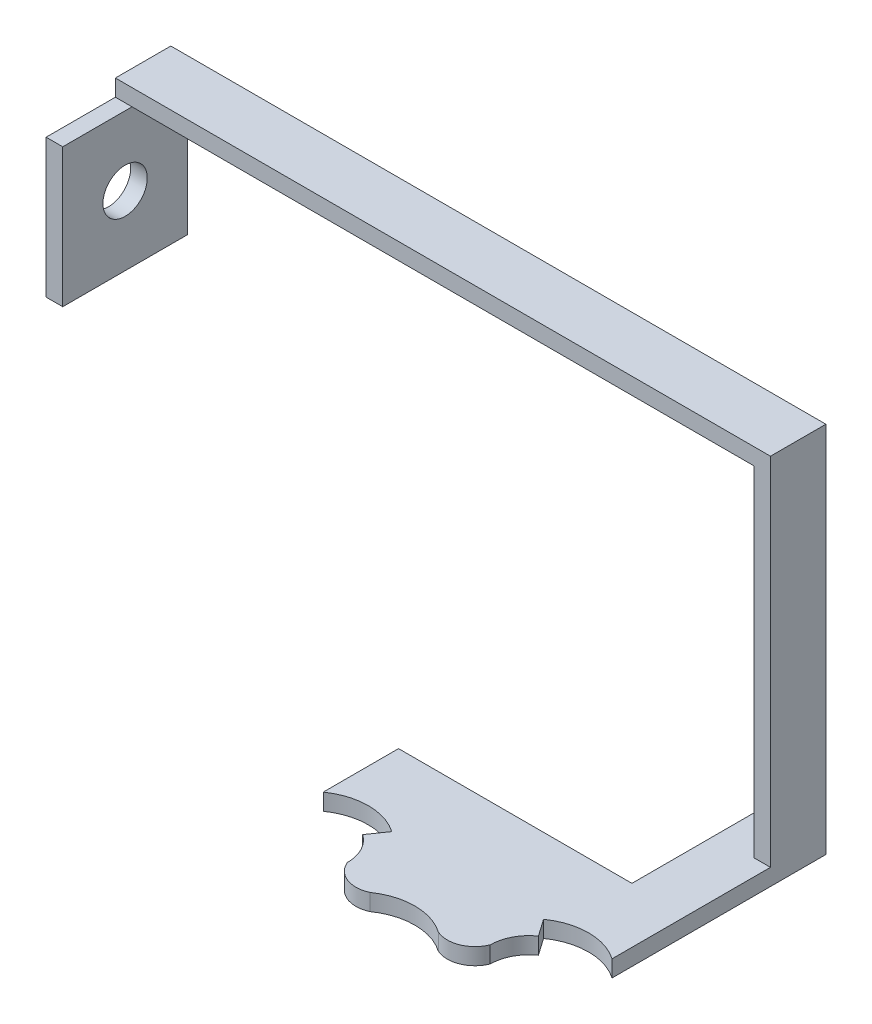
ISO-10303-21;
HEADER;
FILE_DESCRIPTION(('STEP AP214'),'2;1');
FILE_NAME('part.step','',(''),(''),'','','');
FILE_SCHEMA(('AUTOMOTIVE_DESIGN { 1 0 10303 214 1 1 1 1 }'));
ENDSEC;
DATA;
#1=APPLICATION_CONTEXT('core data for automotive mechanical design processes');
#2=APPLICATION_PROTOCOL_DEFINITION('international standard','automotive_design',2000,#1);
#3=PRODUCT_CONTEXT('',#1,'mechanical');
#4=PRODUCT('Part','Part','',(#3));
#5=PRODUCT_RELATED_PRODUCT_CATEGORY('part','',(#4));
#6=PRODUCT_DEFINITION_FORMATION('','',#4);
#7=PRODUCT_DEFINITION_CONTEXT('part definition',#1,'design');
#8=PRODUCT_DEFINITION('design','',#6,#7);
#9=PRODUCT_DEFINITION_SHAPE('','',#8);
#10=(LENGTH_UNIT() NAMED_UNIT(*) SI_UNIT(.MILLI.,.METRE.));
#11=(NAMED_UNIT(*) PLANE_ANGLE_UNIT() SI_UNIT($,.RADIAN.));
#12=(NAMED_UNIT(*) SI_UNIT($,.STERADIAN.) SOLID_ANGLE_UNIT());
#13=UNCERTAINTY_MEASURE_WITH_UNIT(LENGTH_MEASURE(1.E-05),#10,'distance_accuracy_value','');
#14=(GEOMETRIC_REPRESENTATION_CONTEXT(3) GLOBAL_UNCERTAINTY_ASSIGNED_CONTEXT((#13)) GLOBAL_UNIT_ASSIGNED_CONTEXT((#10,
#11,#12)) REPRESENTATION_CONTEXT('',''));
#15=CARTESIAN_POINT('',(0.,0.,0.));
#16=DIRECTION('',(0.,0.,1.));
#17=DIRECTION('',(1.,0.,0.));
#18=AXIS2_PLACEMENT_3D('',#15,#16,#17);
#19=CARTESIAN_POINT('',(-92.1544308814646,64.25,-58.8892135655432));
#20=DIRECTION('',(0.,1.,0.));
#21=DIRECTION('',(0.,0.,1.));
#22=AXIS2_PLACEMENT_3D('',#19,#20,#21);
#23=PLANE('',#22);
#24=DIRECTION('',(0.,0.,1.));
#25=VECTOR('',#24,1.);
#26=CARTESIAN_POINT('',(-89.1544308814646,64.25,-58.8892135655432));
#27=LINE('',#26,#25);
#28=CARTESIAN_POINT('',(-89.1544308814646,64.25,-58.8892135655432));
#29=VERTEX_POINT('',#28);
#30=CARTESIAN_POINT('',(-89.1544308814646,64.25,-48.8892135655432));
#31=VERTEX_POINT('',#30);
#32=EDGE_CURVE('E609',#29,#31,#27,.T.);
#33=ORIENTED_EDGE('',*,*,#32,.F.);
#34=DIRECTION('',(1.,0.,0.));
#35=VECTOR('',#34,1.);
#36=CARTESIAN_POINT('',(-92.1544308814646,64.25,-58.8892135655432));
#37=LINE('',#36,#35);
#38=CARTESIAN_POINT('',(23.0555691185354,64.25,-58.8892135655432));
#39=VERTEX_POINT('',#38);
#40=EDGE_CURVE('E221',#29,#39,#37,.T.);
#41=ORIENTED_EDGE('',*,*,#40,.T.);
#42=DIRECTION('',(0.,0.,1.));
#43=VECTOR('',#42,1.);
#44=CARTESIAN_POINT('',(23.0555691185354,64.25,-58.8892135655432));
#45=LINE('',#44,#43);
#46=CARTESIAN_POINT('',(23.0555691185354,64.25,-48.8892135655432));
#47=VERTEX_POINT('',#46);
#48=EDGE_CURVE('E222',#39,#47,#45,.T.);
#49=ORIENTED_EDGE('',*,*,#48,.T.);
#50=DIRECTION('',(1.,0.,0.));
#51=VECTOR('',#50,1.);
#52=CARTESIAN_POINT('',(-92.1544308814646,64.25,-48.8892135655432));
#53=LINE('',#52,#51);
#54=EDGE_CURVE('E237',#31,#47,#53,.T.);
#55=ORIENTED_EDGE('',*,*,#54,.F.);
#56=EDGE_LOOP('',(#33,#41,#49,#55));
#57=FACE_BOUND('',#56,.T.);
#58=ADVANCED_FACE('F41',(#57),#23,.F.);
#59=CARTESIAN_POINT('',(23.0555691185354,67.25,-58.8892135655432));
#60=DIRECTION('',(1.,0.,0.));
#61=DIRECTION('',(0.,0.,-1.));
#62=AXIS2_PLACEMENT_3D('',#59,#60,#61);
#63=PLANE('',#62);
#64=ORIENTED_EDGE('',*,*,#48,.F.);
#65=DIRECTION('',(0.,-1.,0.));
#66=VECTOR('',#65,1.);
#67=CARTESIAN_POINT('',(23.0555691185354,67.25,-58.8892135655432));
#68=LINE('',#67,#66);
#69=CARTESIAN_POINT('',(23.0555691185354,3.,-58.8892135655432));
#70=VERTEX_POINT('',#69);
#71=EDGE_CURVE('E56',#39,#70,#68,.T.);
#72=ORIENTED_EDGE('',*,*,#71,.T.);
#73=DIRECTION('',(0.,0.,1.));
#74=VECTOR('',#73,1.);
#75=CARTESIAN_POINT('',(23.0555691185354,3.,-58.8892135655432));
#76=LINE('',#75,#74);
#77=CARTESIAN_POINT('',(23.0555691185354,3.,-48.8892135655432));
#78=VERTEX_POINT('',#77);
#79=EDGE_CURVE('E243',#70,#78,#76,.T.);
#80=ORIENTED_EDGE('',*,*,#79,.T.);
#81=DIRECTION('',(0.,-1.,0.));
#82=VECTOR('',#81,1.);
#83=CARTESIAN_POINT('',(23.0555691185354,67.25,-48.8892135655432));
#84=LINE('',#83,#82);
#85=EDGE_CURVE('E257',#47,#78,#84,.T.);
#86=ORIENTED_EDGE('',*,*,#85,.F.);
#87=EDGE_LOOP('',(#64,#72,#80,#86));
#88=FACE_BOUND('',#87,.T.);
#89=ADVANCED_FACE('F429',(#88),#63,.F.);
#90=CARTESIAN_POINT('',(-19.8752830168529,3.,-11.4749999999999));
#91=DIRECTION('',(0.,-1.,0.));
#92=DIRECTION('',(0.,0.,-1.));
#93=AXIS2_PLACEMENT_3D('',#90,#91,#92);
#94=PLANE('',#93);
#95=DIRECTION('',(1.,0.,0.));
#96=VECTOR('',#95,1.);
#97=CARTESIAN_POINT('',(26.0555691185354,3.,-48.8892135655432));
#98=LINE('',#97,#96);
#99=CARTESIAN_POINT('',(26.0555691185354,3.,-48.8892135655432));
#100=VERTEX_POINT('',#99);
#101=EDGE_CURVE('E247',#78,#100,#98,.T.);
#102=ORIENTED_EDGE('',*,*,#101,.F.);
#103=ORIENTED_EDGE('',*,*,#79,.F.);
#104=DIRECTION('',(1.,0.,0.));
#105=VECTOR('',#104,1.);
#106=CARTESIAN_POINT('',(26.0555691185354,3.,-58.8892135655432));
#107=LINE('',#106,#105);
#108=CARTESIAN_POINT('',(16.0555691185354,3.,-58.8892135655432));
#109=VERTEX_POINT('',#108);
#110=EDGE_CURVE('E265',#109,#70,#107,.T.);
#111=ORIENTED_EDGE('',*,*,#110,.F.);
#112=DIRECTION('',(0.,0.,1.));
#113=VECTOR('',#112,1.);
#114=CARTESIAN_POINT('',(16.0555691185354,3.,-58.8892135655432));
#115=LINE('',#114,#113);
#116=CARTESIAN_POINT('',(16.0555691185354,3.,-33.8892135655432));
#117=VERTEX_POINT('',#116);
#118=EDGE_CURVE('E271',#109,#117,#115,.T.);
#119=ORIENTED_EDGE('',*,*,#118,.T.);
#120=DIRECTION('',(-1.,0.,0.));
#121=VECTOR('',#120,1.);
#122=CARTESIAN_POINT('',(-26.0555691185354,3.,-33.8892135655432));
#123=LINE('',#122,#121);
#124=CARTESIAN_POINT('',(-26.0555691185354,3.,-33.8892135655432));
#125=VERTEX_POINT('',#124);
#126=EDGE_CURVE('E301',#117,#125,#123,.T.);
#127=ORIENTED_EDGE('',*,*,#126,.T.);
#128=DIRECTION('',(0.,0.,1.));
#129=VECTOR('',#128,1.);
#130=CARTESIAN_POINT('',(-26.0555691185354,3.,-20.3013632772138));
#131=LINE('',#130,#129);
#132=CARTESIAN_POINT('',(-26.0555691185354,3.,-20.3013632772138));
#133=VERTEX_POINT('',#132);
#134=EDGE_CURVE('E303',#125,#133,#131,.T.);
#135=ORIENTED_EDGE('',*,*,#134,.T.);
#136=CARTESIAN_POINT('',(-19.8752830168529,3.,-11.4749999999999));
#137=DIRECTION('',(0.,-1.,0.));
#138=DIRECTION('',(0.,0.,-1.));
#139=AXIS2_PLACEMENT_3D('',#136,#137,#138);
#140=CIRCLE('',#139,10.775);
#141=CARTESIAN_POINT('',(-13.6949969151704,3.,-20.3013632772138));
#142=VERTEX_POINT('',#141);
#143=EDGE_CURVE('E280',#133,#142,#140,.T.);
#144=ORIENTED_EDGE('',*,*,#143,.T.);
#145=DIRECTION('',(-0.573576436351044,0.,0.819152044288993));
#146=VECTOR('',#145,1.);
#147=CARTESIAN_POINT('',(-15.8602479623956,3.,-17.2090643100228));
#148=LINE('',#147,#146);
#149=CARTESIAN_POINT('',(-15.8602479623956,3.,-17.2090643100228));
#150=VERTEX_POINT('',#149);
#151=EDGE_CURVE('E283',#142,#150,#148,.T.);
#152=ORIENTED_EDGE('',*,*,#151,.T.);
#153=CARTESIAN_POINT('',(-19.875283016853,3.,-11.4749999999998));
#154=DIRECTION('',(0.,-1.,0.));
#155=DIRECTION('',(0.,0.,-1.));
#156=AXIS2_PLACEMENT_3D('',#153,#154,#155);
#157=CIRCLE('',#156,7.00000000000008);
#158=CARTESIAN_POINT('',(-12.8752830168529,3.,-11.4749999999999));
#159=VERTEX_POINT('',#158);
#160=EDGE_CURVE('E286',#150,#159,#157,.T.);
#161=ORIENTED_EDGE('',*,*,#160,.T.);
#162=CARTESIAN_POINT('',(-8.25129203559566,3.,-13.3772900423571));
#163=DIRECTION('',(0.,1.,0.));
#164=DIRECTION('',(0.,0.,1.));
#165=AXIS2_PLACEMENT_3D('',#162,#163,#164);
#166=CIRCLE('',#165,5.);
#167=CARTESIAN_POINT('',(-6.18028610168251,3.,-8.82636327721389));
#168=VERTEX_POINT('',#167);
#169=EDGE_CURVE('E288',#159,#168,#166,.T.);
#170=ORIENTED_EDGE('',*,*,#169,.T.);
#171=CARTESIAN_POINT('',(0.,3.,0.));
#172=DIRECTION('',(0.,-1.,0.));
#173=DIRECTION('',(0.,0.,-1.));
#174=AXIS2_PLACEMENT_3D('',#171,#172,#173);
#175=CIRCLE('',#174,10.775);
#176=CARTESIAN_POINT('',(6.18028610168249,3.,-8.8263632772139));
#177=VERTEX_POINT('',#176);
#178=EDGE_CURVE('E290',#168,#177,#175,.T.);
#179=ORIENTED_EDGE('',*,*,#178,.T.);
#180=CARTESIAN_POINT('',(8.25129203559566,3.,-13.3772900423571));
#181=DIRECTION('',(0.,1.,0.));
#182=DIRECTION('',(0.,0.,1.));
#183=AXIS2_PLACEMENT_3D('',#180,#181,#182);
#184=CIRCLE('',#183,5.00000000000001);
#185=CARTESIAN_POINT('',(12.8752830168529,3.,-11.4749999999998));
#186=VERTEX_POINT('',#185);
#187=EDGE_CURVE('E292',#177,#186,#184,.T.);
#188=ORIENTED_EDGE('',*,*,#187,.T.);
#189=CARTESIAN_POINT('',(19.875283016853,3.,-11.4749999999998));
#190=DIRECTION('',(0.,-1.,0.));
#191=DIRECTION('',(0.,0.,-1.));
#192=AXIS2_PLACEMENT_3D('',#189,#190,#191);
#193=CIRCLE('',#192,7.0000000000001);
#194=CARTESIAN_POINT('',(15.8602479623956,3.,-17.2090643100228));
#195=VERTEX_POINT('',#194);
#196=EDGE_CURVE('E294',#186,#195,#193,.T.);
#197=ORIENTED_EDGE('',*,*,#196,.T.);
#198=DIRECTION('',(-0.573576436351045,0.,-0.819152044288992));
#199=VECTOR('',#198,1.);
#200=CARTESIAN_POINT('',(15.8602479623956,3.,-17.2090643100228));
#201=LINE('',#200,#199);
#202=CARTESIAN_POINT('',(13.6949969151704,3.,-20.3013632772138));
#203=VERTEX_POINT('',#202);
#204=EDGE_CURVE('E296',#195,#203,#201,.T.);
#205=ORIENTED_EDGE('',*,*,#204,.T.);
#206=CARTESIAN_POINT('',(19.8752830168529,3.,-11.4749999999998));
#207=DIRECTION('',(0.,-1.,0.));
#208=DIRECTION('',(0.,0.,-1.));
#209=AXIS2_PLACEMENT_3D('',#206,#207,#208);
#210=CIRCLE('',#209,10.775);
#211=CARTESIAN_POINT('',(26.0555691185354,3.,-20.3013632772138));
#212=VERTEX_POINT('',#211);
#213=EDGE_CURVE('E298',#203,#212,#210,.T.);
#214=ORIENTED_EDGE('',*,*,#213,.T.);
#215=DIRECTION('',(0.,0.,-1.));
#216=VECTOR('',#215,1.);
#217=CARTESIAN_POINT('',(26.0555691185354,3.,-33.8892135655432));
#218=LINE('',#217,#216);
#219=EDGE_CURVE('E64',#212,#100,#218,.T.);
#220=ORIENTED_EDGE('',*,*,#219,.T.);
#221=EDGE_LOOP('',(#102,#103,#111,#119,#127,#135,#144,#152,#161,#170,#179,#188,#197,#205,#214,#220));
#222=FACE_BOUND('',#221,.T.);
#223=ADVANCED_FACE('F377',(#222),#94,.F.);
#224=CARTESIAN_POINT('',(-26.0555691185354,3.,-33.8892135655432));
#225=DIRECTION('',(0.,0.,1.));
#226=DIRECTION('',(1.,0.,0.));
#227=AXIS2_PLACEMENT_3D('',#224,#225,#226);
#228=PLANE('',#227);
#229=DIRECTION('',(0.,1.,0.));
#230=VECTOR('',#229,1.);
#231=CARTESIAN_POINT('',(16.0555691185354,0.,-33.8892135655432));
#232=LINE('',#231,#230);
#233=CARTESIAN_POINT('',(16.0555691185354,0.,-33.8892135655432));
#234=VERTEX_POINT('',#233);
#235=EDGE_CURVE('E260',#234,#117,#232,.T.);
#236=ORIENTED_EDGE('',*,*,#235,.F.);
#237=DIRECTION('',(-1.,0.,0.));
#238=VECTOR('',#237,1.);
#239=CARTESIAN_POINT('',(-26.0555691185354,0.,-33.8892135655432));
#240=LINE('',#239,#238);
#241=CARTESIAN_POINT('',(-26.0555691185354,0.,-33.8892135655432));
#242=VERTEX_POINT('',#241);
#243=EDGE_CURVE('E326',#234,#242,#240,.T.);
#244=ORIENTED_EDGE('',*,*,#243,.T.);
#245=DIRECTION('',(0.,-1.,0.));
#246=VECTOR('',#245,1.);
#247=CARTESIAN_POINT('',(-26.0555691185354,3.,-33.8892135655432));
#248=LINE('',#247,#246);
#249=EDGE_CURVE('E331',#125,#242,#248,.T.);
#250=ORIENTED_EDGE('',*,*,#249,.F.);
#251=ORIENTED_EDGE('',*,*,#126,.F.);
#252=EDGE_LOOP('',(#236,#244,#250,#251));
#253=FACE_BOUND('',#252,.T.);
#254=ADVANCED_FACE('F392',(#253),#228,.F.);
#255=CARTESIAN_POINT('',(-19.8752830168529,3.,-11.4749999999999));
#256=DIRECTION('',(0.,-1.,0.));
#257=DIRECTION('',(0.,0.,-1.));
#258=AXIS2_PLACEMENT_3D('',#255,#256,#257);
#259=CYLINDRICAL_SURFACE('',#258,10.775);
#260=CARTESIAN_POINT('',(-19.8752830168529,0.,-11.4749999999999));
#261=DIRECTION('',(0.,-1.,0.));
#262=DIRECTION('',(0.,0.,-1.));
#263=AXIS2_PLACEMENT_3D('',#260,#261,#262);
#264=CIRCLE('',#263,10.775);
#265=CARTESIAN_POINT('',(-26.0555691185354,0.,-20.3013632772138));
#266=VERTEX_POINT('',#265);
#267=CARTESIAN_POINT('',(-13.6949969151704,0.,-20.3013632772138));
#268=VERTEX_POINT('',#267);
#269=EDGE_CURVE('E279',#266,#268,#264,.T.);
#270=ORIENTED_EDGE('',*,*,#269,.T.);
#271=DIRECTION('',(0.,-1.,0.));
#272=VECTOR('',#271,1.);
#273=CARTESIAN_POINT('',(-13.6949969151704,3.,-20.3013632772138));
#274=LINE('',#273,#272);
#275=EDGE_CURVE('E11',#142,#268,#274,.T.);
#276=ORIENTED_EDGE('',*,*,#275,.F.);
#277=ORIENTED_EDGE('',*,*,#143,.F.);
#278=DIRECTION('',(0.,-1.,0.));
#279=VECTOR('',#278,1.);
#280=CARTESIAN_POINT('',(-26.0555691185354,3.,-20.3013632772138));
#281=LINE('',#280,#279);
#282=EDGE_CURVE('E305',#133,#266,#281,.T.);
#283=ORIENTED_EDGE('',*,*,#282,.T.);
#284=EDGE_LOOP('',(#270,#276,#277,#283));
#285=FACE_BOUND('',#284,.T.);
#286=ADVANCED_FACE('F43',(#285),#259,.F.);
#287=CARTESIAN_POINT('',(-15.8602479623956,3.,-17.2090643100228));
#288=DIRECTION('',(0.819152044288993,0.,0.573576436351044));
#289=DIRECTION('',(0.573576436351044,0.,-0.819152044288993));
#290=AXIS2_PLACEMENT_3D('',#287,#288,#289);
#291=PLANE('',#290);
#292=DIRECTION('',(-0.573576436351044,0.,0.819152044288993));
#293=VECTOR('',#292,1.);
#294=CARTESIAN_POINT('',(-15.8602479623956,0.,-17.2090643100228));
#295=LINE('',#294,#293);
#296=CARTESIAN_POINT('',(-15.8602479623956,0.,-17.2090643100228));
#297=VERTEX_POINT('',#296);
#298=EDGE_CURVE('E308',#268,#297,#295,.T.);
#299=ORIENTED_EDGE('',*,*,#298,.T.);
#300=DIRECTION('',(0.,-1.,0.));
#301=VECTOR('',#300,1.);
#302=CARTESIAN_POINT('',(-15.8602479623956,3.,-17.2090643100228));
#303=LINE('',#302,#301);
#304=EDGE_CURVE('E49',#150,#297,#303,.T.);
#305=ORIENTED_EDGE('',*,*,#304,.F.);
#306=ORIENTED_EDGE('',*,*,#151,.F.);
#307=ORIENTED_EDGE('',*,*,#275,.T.);
#308=EDGE_LOOP('',(#299,#305,#306,#307));
#309=FACE_BOUND('',#308,.T.);
#310=ADVANCED_FACE('F381',(#309),#291,.F.);
#311=CARTESIAN_POINT('',(-19.875283016853,3.,-11.4749999999998));
#312=DIRECTION('',(0.,-1.,0.));
#313=DIRECTION('',(0.,0.,-1.));
#314=AXIS2_PLACEMENT_3D('',#311,#312,#313);
#315=CYLINDRICAL_SURFACE('',#314,7.00000000000008);
#316=CARTESIAN_POINT('',(-19.875283016853,0.,-11.4749999999998));
#317=DIRECTION('',(0.,-1.,0.));
#318=DIRECTION('',(0.,0.,-1.));
#319=AXIS2_PLACEMENT_3D('',#316,#317,#318);
#320=CIRCLE('',#319,7.00000000000008);
#321=CARTESIAN_POINT('',(-12.8752830168529,0.,-11.4749999999999));
#322=VERTEX_POINT('',#321);
#323=EDGE_CURVE('E310',#297,#322,#320,.T.);
#324=ORIENTED_EDGE('',*,*,#323,.T.);
#325=DIRECTION('',(0.,-1.,0.));
#326=VECTOR('',#325,1.);
#327=CARTESIAN_POINT('',(-12.8752830168529,3.,-11.4749999999999));
#328=LINE('',#327,#326);
#329=EDGE_CURVE('E352',#159,#322,#328,.T.);
#330=ORIENTED_EDGE('',*,*,#329,.F.);
#331=ORIENTED_EDGE('',*,*,#160,.F.);
#332=ORIENTED_EDGE('',*,*,#304,.T.);
#333=EDGE_LOOP('',(#324,#330,#331,#332));
#334=FACE_BOUND('',#333,.T.);
#335=ADVANCED_FACE('F359',(#334),#315,.F.);
#336=CARTESIAN_POINT('',(-8.25129203559566,3.,-13.3772900423571));
#337=DIRECTION('',(0.,-1.,0.));
#338=DIRECTION('',(0.,0.,-1.));
#339=AXIS2_PLACEMENT_3D('',#336,#337,#338);
#340=CYLINDRICAL_SURFACE('',#339,5.);
#341=CARTESIAN_POINT('',(-8.25129203559566,0.,-13.3772900423571));
#342=DIRECTION('',(0.,1.,0.));
#343=DIRECTION('',(0.,0.,1.));
#344=AXIS2_PLACEMENT_3D('',#341,#342,#343);
#345=CIRCLE('',#344,5.);
#346=CARTESIAN_POINT('',(-6.18028610168251,0.,-8.82636327721389));
#347=VERTEX_POINT('',#346);
#348=EDGE_CURVE('E312',#322,#347,#345,.T.);
#349=ORIENTED_EDGE('',*,*,#348,.T.);
#350=DIRECTION('',(0.,-1.,0.));
#351=VECTOR('',#350,1.);
#352=CARTESIAN_POINT('',(-6.18028610168251,3.,-8.82636327721389));
#353=LINE('',#352,#351);
#354=EDGE_CURVE('E349',#168,#347,#353,.T.);
#355=ORIENTED_EDGE('',*,*,#354,.F.);
#356=ORIENTED_EDGE('',*,*,#169,.F.);
#357=ORIENTED_EDGE('',*,*,#329,.T.);
#358=EDGE_LOOP('',(#349,#355,#356,#357));
#359=FACE_BOUND('',#358,.T.);
#360=ADVANCED_FACE('F370',(#359),#340,.T.);
#361=CARTESIAN_POINT('',(0.,3.,0.));
#362=DIRECTION('',(0.,-1.,0.));
#363=DIRECTION('',(0.,0.,-1.));
#364=AXIS2_PLACEMENT_3D('',#361,#362,#363);
#365=CYLINDRICAL_SURFACE('',#364,10.775);
#366=CARTESIAN_POINT('',(0.,0.,0.));
#367=DIRECTION('',(0.,-1.,0.));
#368=DIRECTION('',(0.,0.,-1.));
#369=AXIS2_PLACEMENT_3D('',#366,#367,#368);
#370=CIRCLE('',#369,10.775);
#371=CARTESIAN_POINT('',(6.18028610168249,0.,-8.8263632772139));
#372=VERTEX_POINT('',#371);
#373=EDGE_CURVE('E314',#347,#372,#370,.T.);
#374=ORIENTED_EDGE('',*,*,#373,.T.);
#375=DIRECTION('',(0.,-1.,0.));
#376=VECTOR('',#375,1.);
#377=CARTESIAN_POINT('',(6.18028610168249,3.,-8.8263632772139));
#378=LINE('',#377,#376);
#379=EDGE_CURVE('E346',#177,#372,#378,.T.);
#380=ORIENTED_EDGE('',*,*,#379,.F.);
#381=ORIENTED_EDGE('',*,*,#178,.F.);
#382=ORIENTED_EDGE('',*,*,#354,.T.);
#383=EDGE_LOOP('',(#374,#380,#381,#382));
#384=FACE_BOUND('',#383,.T.);
#385=ADVANCED_FACE('F374',(#384),#365,.F.);
#386=CARTESIAN_POINT('',(8.25129203559566,3.,-13.3772900423571));
#387=DIRECTION('',(0.,-1.,0.));
#388=DIRECTION('',(0.,0.,-1.));
#389=AXIS2_PLACEMENT_3D('',#386,#387,#388);
#390=CYLINDRICAL_SURFACE('',#389,5.00000000000001);
#391=CARTESIAN_POINT('',(8.25129203559566,0.,-13.3772900423571));
#392=DIRECTION('',(0.,1.,0.));
#393=DIRECTION('',(0.,0.,1.));
#394=AXIS2_PLACEMENT_3D('',#391,#392,#393);
#395=CIRCLE('',#394,5.00000000000001);
#396=CARTESIAN_POINT('',(12.8752830168529,0.,-11.4749999999998));
#397=VERTEX_POINT('',#396);
#398=EDGE_CURVE('E316',#372,#397,#395,.T.);
#399=ORIENTED_EDGE('',*,*,#398,.T.);
#400=DIRECTION('',(0.,-1.,0.));
#401=VECTOR('',#400,1.);
#402=CARTESIAN_POINT('',(12.8752830168529,3.,-11.4749999999998));
#403=LINE('',#402,#401);
#404=EDGE_CURVE('E343',#186,#397,#403,.T.);
#405=ORIENTED_EDGE('',*,*,#404,.F.);
#406=ORIENTED_EDGE('',*,*,#187,.F.);
#407=ORIENTED_EDGE('',*,*,#379,.T.);
#408=EDGE_LOOP('',(#399,#405,#406,#407));
#409=FACE_BOUND('',#408,.T.);
#410=ADVANCED_FACE('F419',(#409),#390,.T.);
#411=CARTESIAN_POINT('',(19.875283016853,3.,-11.4749999999998));
#412=DIRECTION('',(0.,-1.,0.));
#413=DIRECTION('',(0.,0.,-1.));
#414=AXIS2_PLACEMENT_3D('',#411,#412,#413);
#415=CYLINDRICAL_SURFACE('',#414,7.0000000000001);
#416=CARTESIAN_POINT('',(19.875283016853,0.,-11.4749999999998));
#417=DIRECTION('',(0.,-1.,0.));
#418=DIRECTION('',(0.,0.,-1.));
#419=AXIS2_PLACEMENT_3D('',#416,#417,#418);
#420=CIRCLE('',#419,7.0000000000001);
#421=CARTESIAN_POINT('',(15.8602479623956,0.,-17.2090643100228));
#422=VERTEX_POINT('',#421);
#423=EDGE_CURVE('E318',#397,#422,#420,.T.);
#424=ORIENTED_EDGE('',*,*,#423,.T.);
#425=DIRECTION('',(0.,-1.,0.));
#426=VECTOR('',#425,1.);
#427=CARTESIAN_POINT('',(15.8602479623956,3.,-17.2090643100228));
#428=LINE('',#427,#426);
#429=EDGE_CURVE('E340',#195,#422,#428,.T.);
#430=ORIENTED_EDGE('',*,*,#429,.F.);
#431=ORIENTED_EDGE('',*,*,#196,.F.);
#432=ORIENTED_EDGE('',*,*,#404,.T.);
#433=EDGE_LOOP('',(#424,#430,#431,#432));
#434=FACE_BOUND('',#433,.T.);
#435=ADVANCED_FACE('F416',(#434),#415,.F.);
#436=CARTESIAN_POINT('',(15.8602479623956,3.,-17.2090643100228));
#437=DIRECTION('',(-0.819152044288992,0.,0.573576436351045));
#438=DIRECTION('',(0.573576436351045,0.,0.819152044288992));
#439=AXIS2_PLACEMENT_3D('',#436,#437,#438);
#440=PLANE('',#439);
#441=DIRECTION('',(-0.573576436351045,0.,-0.819152044288992));
#442=VECTOR('',#441,1.);
#443=CARTESIAN_POINT('',(15.8602479623956,0.,-17.2090643100228));
#444=LINE('',#443,#442);
#445=CARTESIAN_POINT('',(13.6949969151704,0.,-20.3013632772138));
#446=VERTEX_POINT('',#445);
#447=EDGE_CURVE('E320',#422,#446,#444,.T.);
#448=ORIENTED_EDGE('',*,*,#447,.T.);
#449=DIRECTION('',(0.,-1.,0.));
#450=VECTOR('',#449,1.);
#451=CARTESIAN_POINT('',(13.6949969151704,3.,-20.3013632772138));
#452=LINE('',#451,#450);
#453=EDGE_CURVE('E337',#203,#446,#452,.T.);
#454=ORIENTED_EDGE('',*,*,#453,.F.);
#455=ORIENTED_EDGE('',*,*,#204,.F.);
#456=ORIENTED_EDGE('',*,*,#429,.T.);
#457=EDGE_LOOP('',(#448,#454,#455,#456));
#458=FACE_BOUND('',#457,.T.);
#459=ADVANCED_FACE('F412',(#458),#440,.F.);
#460=CARTESIAN_POINT('',(19.8752830168529,3.,-11.4749999999998));
#461=DIRECTION('',(0.,-1.,0.));
#462=DIRECTION('',(0.,0.,-1.));
#463=AXIS2_PLACEMENT_3D('',#460,#461,#462);
#464=CYLINDRICAL_SURFACE('',#463,10.775);
#465=CARTESIAN_POINT('',(19.8752830168529,0.,-11.4749999999998));
#466=DIRECTION('',(0.,-1.,0.));
#467=DIRECTION('',(0.,0.,-1.));
#468=AXIS2_PLACEMENT_3D('',#465,#466,#467);
#469=CIRCLE('',#468,10.775);
#470=CARTESIAN_POINT('',(26.0555691185354,0.,-20.3013632772138));
#471=VERTEX_POINT('',#470);
#472=EDGE_CURVE('E322',#446,#471,#469,.T.);
#473=ORIENTED_EDGE('',*,*,#472,.T.);
#474=DIRECTION('',(0.,-1.,0.));
#475=VECTOR('',#474,1.);
#476=CARTESIAN_POINT('',(26.0555691185354,3.,-20.3013632772138));
#477=LINE('',#476,#475);
#478=EDGE_CURVE('E334',#212,#471,#477,.T.);
#479=ORIENTED_EDGE('',*,*,#478,.F.);
#480=ORIENTED_EDGE('',*,*,#213,.F.);
#481=ORIENTED_EDGE('',*,*,#453,.T.);
#482=EDGE_LOOP('',(#473,#479,#480,#481));
#483=FACE_BOUND('',#482,.T.);
#484=ADVANCED_FACE('F408',(#483),#464,.F.);
#485=CARTESIAN_POINT('',(26.0555691185354,3.,-33.8892135655432));
#486=DIRECTION('',(-1.,0.,0.));
#487=DIRECTION('',(0.,0.,1.));
#488=AXIS2_PLACEMENT_3D('',#485,#486,#487);
#489=PLANE('',#488);
#490=DIRECTION('',(0.,0.,-1.));
#491=VECTOR('',#490,1.);
#492=CARTESIAN_POINT('',(26.0555691185354,0.,-33.8892135655432));
#493=LINE('',#492,#491);
#494=CARTESIAN_POINT('',(26.0555691185354,0.,-58.8892135655432));
#495=VERTEX_POINT('',#494);
#496=EDGE_CURVE('E324',#471,#495,#493,.T.);
#497=ORIENTED_EDGE('',*,*,#496,.T.);
#498=DIRECTION('',(0.,-1.,0.));
#499=VECTOR('',#498,1.);
#500=CARTESIAN_POINT('',(26.0555691185354,0.,-58.8892135655432));
#501=LINE('',#500,#499);
#502=CARTESIAN_POINT('',(26.0555691185354,67.25,-58.8892135655432));
#503=VERTEX_POINT('',#502);
#504=EDGE_CURVE('E268',#503,#495,#501,.T.);
#505=ORIENTED_EDGE('',*,*,#504,.F.);
#506=DIRECTION('',(0.,0.,-1.));
#507=VECTOR('',#506,1.);
#508=CARTESIAN_POINT('',(26.0555691185354,67.25,-58.8892135655432));
#509=LINE('',#508,#507);
#510=CARTESIAN_POINT('',(26.0555691185354,67.25,-48.8892135655432));
#511=VERTEX_POINT('',#510);
#512=EDGE_CURVE('E249',#511,#503,#509,.T.);
#513=ORIENTED_EDGE('',*,*,#512,.F.);
#514=DIRECTION('',(0.,-1.,0.));
#515=VECTOR('',#514,1.);
#516=CARTESIAN_POINT('',(26.0555691185354,67.25,-48.8892135655432));
#517=LINE('',#516,#515);
#518=EDGE_CURVE('E252',#511,#100,#517,.T.);
#519=ORIENTED_EDGE('',*,*,#518,.T.);
#520=ORIENTED_EDGE('',*,*,#219,.F.);
#521=ORIENTED_EDGE('',*,*,#478,.T.);
#522=EDGE_LOOP('',(#497,#505,#513,#519,#520,#521));
#523=FACE_BOUND('',#522,.T.);
#524=ADVANCED_FACE('F403',(#523),#489,.F.);
#525=CARTESIAN_POINT('',(-26.0555691185354,3.,-20.3013632772138));
#526=DIRECTION('',(1.,0.,0.));
#527=DIRECTION('',(0.,0.,-1.));
#528=AXIS2_PLACEMENT_3D('',#525,#526,#527);
#529=PLANE('',#528);
#530=DIRECTION('',(0.,0.,1.));
#531=VECTOR('',#530,1.);
#532=CARTESIAN_POINT('',(-26.0555691185354,0.,-20.3013632772138));
#533=LINE('',#532,#531);
#534=EDGE_CURVE('E284',#242,#266,#533,.T.);
#535=ORIENTED_EDGE('',*,*,#534,.T.);
#536=ORIENTED_EDGE('',*,*,#282,.F.);
#537=ORIENTED_EDGE('',*,*,#134,.F.);
#538=ORIENTED_EDGE('',*,*,#249,.T.);
#539=EDGE_LOOP('',(#535,#536,#537,#538));
#540=FACE_BOUND('',#539,.T.);
#541=ADVANCED_FACE('F388',(#540),#529,.F.);
#542=CARTESIAN_POINT('',(-19.8752830168529,0.,-11.4749999999999));
#543=DIRECTION('',(0.,-1.,0.));
#544=DIRECTION('',(0.,0.,-1.));
#545=AXIS2_PLACEMENT_3D('',#542,#543,#544);
#546=PLANE('',#545);
#547=ORIENTED_EDGE('',*,*,#269,.F.);
#548=ORIENTED_EDGE('',*,*,#534,.F.);
#549=ORIENTED_EDGE('',*,*,#243,.F.);
#550=DIRECTION('',(0.,0.,1.));
#551=VECTOR('',#550,1.);
#552=CARTESIAN_POINT('',(16.0555691185354,0.,-58.8892135655432));
#553=LINE('',#552,#551);
#554=CARTESIAN_POINT('',(16.0555691185354,0.,-58.8892135655432));
#555=VERTEX_POINT('',#554);
#556=EDGE_CURVE('E276',#555,#234,#553,.T.);
#557=ORIENTED_EDGE('',*,*,#556,.F.);
#558=DIRECTION('',(-1.,0.,0.));
#559=VECTOR('',#558,1.);
#560=CARTESIAN_POINT('',(26.0555691185354,0.,-58.8892135655432));
#561=LINE('',#560,#559);
#562=EDGE_CURVE('E261',#495,#555,#561,.T.);
#563=ORIENTED_EDGE('',*,*,#562,.F.);
#564=ORIENTED_EDGE('',*,*,#496,.F.);
#565=ORIENTED_EDGE('',*,*,#472,.F.);
#566=ORIENTED_EDGE('',*,*,#447,.F.);
#567=ORIENTED_EDGE('',*,*,#423,.F.);
#568=ORIENTED_EDGE('',*,*,#398,.F.);
#569=ORIENTED_EDGE('',*,*,#373,.F.);
#570=ORIENTED_EDGE('',*,*,#348,.F.);
#571=ORIENTED_EDGE('',*,*,#323,.F.);
#572=ORIENTED_EDGE('',*,*,#298,.F.);
#573=EDGE_LOOP('',(#547,#548,#549,#557,#563,#564,#565,#566,#567,#568,#569,#570,#571,#572));
#574=FACE_BOUND('',#573,.T.);
#575=ADVANCED_FACE('F365',(#574),#546,.T.);
#576=CARTESIAN_POINT('',(16.0555691185354,0.,-58.8892135655432));
#577=DIRECTION('',(1.,0.,0.));
#578=DIRECTION('',(0.,0.,-1.));
#579=AXIS2_PLACEMENT_3D('',#576,#577,#578);
#580=PLANE('',#579);
#581=ORIENTED_EDGE('',*,*,#235,.T.);
#582=ORIENTED_EDGE('',*,*,#118,.F.);
#583=DIRECTION('',(0.,1.,0.));
#584=VECTOR('',#583,1.);
#585=CARTESIAN_POINT('',(16.0555691185354,0.,-58.8892135655432));
#586=LINE('',#585,#584);
#587=EDGE_CURVE('E263',#555,#109,#586,.T.);
#588=ORIENTED_EDGE('',*,*,#587,.F.);
#589=ORIENTED_EDGE('',*,*,#556,.T.);
#590=EDGE_LOOP('',(#581,#582,#588,#589));
#591=FACE_BOUND('',#590,.T.);
#592=ADVANCED_FACE('F395',(#591),#580,.F.);
#593=CARTESIAN_POINT('',(0.,0.,-58.8892135655432));
#594=DIRECTION('',(0.,0.,-1.));
#595=DIRECTION('',(-1.,0.,0.));
#596=AXIS2_PLACEMENT_3D('',#593,#594,#595);
#597=PLANE('',#596);
#598=ORIENTED_EDGE('',*,*,#562,.T.);
#599=ORIENTED_EDGE('',*,*,#587,.T.);
#600=ORIENTED_EDGE('',*,*,#110,.T.);
#601=ORIENTED_EDGE('',*,*,#71,.F.);
#602=ORIENTED_EDGE('',*,*,#40,.F.);
#603=DIRECTION('',(0.,1.,0.));
#604=VECTOR('',#603,1.);
#605=CARTESIAN_POINT('',(-89.1544308814646,39.25,-58.8892135655432));
#606=LINE('',#605,#604);
#607=CARTESIAN_POINT('',(-89.1544308814646,39.25,-58.8892135655432));
#608=VERTEX_POINT('',#607);
#609=EDGE_CURVE('E200',#608,#29,#606,.T.);
#610=ORIENTED_EDGE('',*,*,#609,.F.);
#611=DIRECTION('',(1.,0.,0.));
#612=VECTOR('',#611,1.);
#613=CARTESIAN_POINT('',(-92.1544308814646,39.25,-58.8892135655432));
#614=LINE('',#613,#612);
#615=CARTESIAN_POINT('',(-92.1544308814646,39.25,-58.8892135655432));
#616=VERTEX_POINT('',#615);
#617=EDGE_CURVE('E207',#616,#608,#614,.T.);
#618=ORIENTED_EDGE('',*,*,#617,.F.);
#619=DIRECTION('',(0.,-1.,0.));
#620=VECTOR('',#619,1.);
#621=CARTESIAN_POINT('',(-92.1544308814646,67.25,-58.8892135655432));
#622=LINE('',#621,#620);
#623=CARTESIAN_POINT('',(-92.1544308814646,67.25,-58.8892135655432));
#624=VERTEX_POINT('',#623);
#625=EDGE_CURVE('E225',#624,#616,#622,.T.);
#626=ORIENTED_EDGE('',*,*,#625,.F.);
#627=DIRECTION('',(-1.,0.,0.));
#628=VECTOR('',#627,1.);
#629=CARTESIAN_POINT('',(26.0555691185354,67.25,-58.8892135655432));
#630=LINE('',#629,#628);
#631=EDGE_CURVE('E244',#503,#624,#630,.T.);
#632=ORIENTED_EDGE('',*,*,#631,.F.);
#633=ORIENTED_EDGE('',*,*,#504,.T.);
#634=EDGE_LOOP('',(#598,#599,#600,#601,#602,#610,#618,#626,#632,#633));
#635=FACE_BOUND('',#634,.T.);
#636=ADVANCED_FACE('F220',(#635),#597,.T.);
#637=CARTESIAN_POINT('',(26.0555691185354,67.25,-48.8892135655432));
#638=DIRECTION('',(0.,0.,-1.));
#639=DIRECTION('',(-1.,0.,0.));
#640=AXIS2_PLACEMENT_3D('',#637,#638,#639);
#641=PLANE('',#640);
#642=ORIENTED_EDGE('',*,*,#101,.T.);
#643=ORIENTED_EDGE('',*,*,#518,.F.);
#644=DIRECTION('',(1.,0.,0.));
#645=VECTOR('',#644,1.);
#646=CARTESIAN_POINT('',(26.0555691185354,67.25,-48.8892135655432));
#647=LINE('',#646,#645);
#648=CARTESIAN_POINT('',(-92.1544308814646,67.25,-48.8892135655432));
#649=VERTEX_POINT('',#648);
#650=EDGE_CURVE('E246',#649,#511,#647,.T.);
#651=ORIENTED_EDGE('',*,*,#650,.F.);
#652=DIRECTION('',(0.,1.,0.));
#653=VECTOR('',#652,1.);
#654=CARTESIAN_POINT('',(-92.1544308814646,67.25,-48.8892135655432));
#655=LINE('',#654,#653);
#656=CARTESIAN_POINT('',(-92.1544308814646,64.25,-48.8892135655432));
#657=VERTEX_POINT('',#656);
#658=EDGE_CURVE('E232',#657,#649,#655,.T.);
#659=ORIENTED_EDGE('',*,*,#658,.F.);
#660=EDGE_CURVE('E239',#657,#31,#53,.T.);
#661=ORIENTED_EDGE('',*,*,#660,.T.);
#662=ORIENTED_EDGE('',*,*,#54,.T.);
#663=ORIENTED_EDGE('',*,*,#85,.T.);
#664=EDGE_LOOP('',(#642,#643,#651,#659,#661,#662,#663));
#665=FACE_BOUND('',#664,.T.);
#666=ADVANCED_FACE('F444',(#665),#641,.F.);
#667=CARTESIAN_POINT('',(0.,67.25,0.));
#668=DIRECTION('',(0.,1.,0.));
#669=DIRECTION('',(0.,0.,1.));
#670=AXIS2_PLACEMENT_3D('',#667,#668,#669);
#671=PLANE('',#670);
#672=ORIENTED_EDGE('',*,*,#631,.T.);
#673=DIRECTION('',(0.,0.,-1.));
#674=VECTOR('',#673,1.);
#675=CARTESIAN_POINT('',(-92.1544308814646,67.25,-58.8892135655432));
#676=LINE('',#675,#674);
#677=EDGE_CURVE('E235',#649,#624,#676,.T.);
#678=ORIENTED_EDGE('',*,*,#677,.F.);
#679=ORIENTED_EDGE('',*,*,#650,.T.);
#680=ORIENTED_EDGE('',*,*,#512,.T.);
#681=EDGE_LOOP('',(#672,#678,#679,#680));
#682=FACE_BOUND('',#681,.T.);
#683=ADVANCED_FACE('F442',(#682),#671,.T.);
#684=CARTESIAN_POINT('',(-92.1544308814646,0.,0.));
#685=DIRECTION('',(-1.,0.,0.));
#686=DIRECTION('',(0.,0.,1.));
#687=AXIS2_PLACEMENT_3D('',#684,#685,#686);
#688=PLANE('',#687);
#689=CARTESIAN_POINT('',(-92.1544308814646,51.75,-47.6392135655432));
#690=DIRECTION('',(-1.,0.,0.));
#691=DIRECTION('',(0.,0.,1.));
#692=AXIS2_PLACEMENT_3D('',#689,#690,#691);
#693=CIRCLE('',#692,4.);
#694=CARTESIAN_POINT('',(-92.1544308814646,51.75,-43.6392135655432));
#695=VERTEX_POINT('',#694);
#696=EDGE_CURVE('E602',#695,#695,#693,.T.);
#697=ORIENTED_EDGE('',*,*,#696,.F.);
#698=EDGE_LOOP('',(#697));
#699=FACE_BOUND('',#698,.T.);
#700=ORIENTED_EDGE('',*,*,#625,.T.);
#701=DIRECTION('',(0.,0.,-1.));
#702=VECTOR('',#701,1.);
#703=CARTESIAN_POINT('',(-92.1544308814646,39.25,-58.8892135655432));
#704=LINE('',#703,#702);
#705=CARTESIAN_POINT('',(-92.1544308814646,39.25,-36.3892135655432));
#706=VERTEX_POINT('',#705);
#707=EDGE_CURVE('E213',#706,#616,#704,.T.);
#708=ORIENTED_EDGE('',*,*,#707,.F.);
#709=DIRECTION('',(0.,1.,0.));
#710=VECTOR('',#709,1.);
#711=CARTESIAN_POINT('',(-92.1544308814646,39.25,-36.3892135655432));
#712=LINE('',#711,#710);
#713=CARTESIAN_POINT('',(-92.1544308814646,64.25,-36.3892135655432));
#714=VERTEX_POINT('',#713);
#715=EDGE_CURVE('E227',#706,#714,#712,.T.);
#716=ORIENTED_EDGE('',*,*,#715,.T.);
#717=DIRECTION('',(0.,0.,-1.));
#718=VECTOR('',#717,1.);
#719=CARTESIAN_POINT('',(-92.1544308814646,64.25,-58.8892135655432));
#720=LINE('',#719,#718);
#721=EDGE_CURVE('E216',#714,#657,#720,.T.);
#722=ORIENTED_EDGE('',*,*,#721,.T.);
#723=ORIENTED_EDGE('',*,*,#658,.T.);
#724=ORIENTED_EDGE('',*,*,#677,.T.);
#725=EDGE_LOOP('',(#700,#708,#716,#722,#723,#724));
#726=FACE_BOUND('',#725,.T.);
#727=ADVANCED_FACE('F440',(#699,#726),#688,.T.);
#728=CARTESIAN_POINT('',(0.,64.25,0.));
#729=DIRECTION('',(0.,-1.,0.));
#730=DIRECTION('',(0.,0.,-1.));
#731=AXIS2_PLACEMENT_3D('',#728,#729,#730);
#732=PLANE('',#731);
#733=CARTESIAN_POINT('',(-89.1544308814646,64.25,-36.3892135655432));
#734=VERTEX_POINT('',#733);
#735=EDGE_CURVE('E604',#31,#734,#27,.T.);
#736=ORIENTED_EDGE('',*,*,#735,.F.);
#737=ORIENTED_EDGE('',*,*,#660,.F.);
#738=ORIENTED_EDGE('',*,*,#721,.F.);
#739=DIRECTION('',(-1.,0.,0.));
#740=VECTOR('',#739,1.);
#741=CARTESIAN_POINT('',(-92.1544308814646,64.25,-36.3892135655432));
#742=LINE('',#741,#740);
#743=EDGE_CURVE('E611',#734,#714,#742,.T.);
#744=ORIENTED_EDGE('',*,*,#743,.F.);
#745=EDGE_LOOP('',(#736,#737,#738,#744));
#746=FACE_BOUND('',#745,.T.);
#747=ADVANCED_FACE('F535',(#746),#732,.F.);
#748=CARTESIAN_POINT('',(-89.1544308814646,39.25,-58.8892135655432));
#749=DIRECTION('',(-1.,0.,0.));
#750=DIRECTION('',(0.,0.,1.));
#751=AXIS2_PLACEMENT_3D('',#748,#749,#750);
#752=PLANE('',#751);
#753=CARTESIAN_POINT('',(-89.1544308814646,51.75,-47.6392135655432));
#754=DIRECTION('',(-1.,0.,0.));
#755=DIRECTION('',(0.,0.,1.));
#756=AXIS2_PLACEMENT_3D('',#753,#754,#755);
#757=CIRCLE('',#756,4.);
#758=CARTESIAN_POINT('',(-89.1544308814646,51.75,-43.6392135655432));
#759=VERTEX_POINT('',#758);
#760=EDGE_CURVE('E599',#759,#759,#757,.F.);
#761=ORIENTED_EDGE('',*,*,#760,.F.);
#762=EDGE_LOOP('',(#761));
#763=FACE_BOUND('',#762,.T.);
#764=ORIENTED_EDGE('',*,*,#32,.T.);
#765=ORIENTED_EDGE('',*,*,#735,.T.);
#766=DIRECTION('',(0.,1.,0.));
#767=VECTOR('',#766,1.);
#768=CARTESIAN_POINT('',(-89.1544308814646,39.25,-36.3892135655432));
#769=LINE('',#768,#767);
#770=CARTESIAN_POINT('',(-89.1544308814646,39.25,-36.3892135655432));
#771=VERTEX_POINT('',#770);
#772=EDGE_CURVE('E203',#771,#734,#769,.T.);
#773=ORIENTED_EDGE('',*,*,#772,.F.);
#774=DIRECTION('',(0.,0.,1.));
#775=VECTOR('',#774,1.);
#776=CARTESIAN_POINT('',(-89.1544308814646,39.25,-58.8892135655432));
#777=LINE('',#776,#775);
#778=EDGE_CURVE('E195',#608,#771,#777,.T.);
#779=ORIENTED_EDGE('',*,*,#778,.F.);
#780=ORIENTED_EDGE('',*,*,#609,.T.);
#781=EDGE_LOOP('',(#764,#765,#773,#779,#780));
#782=FACE_BOUND('',#781,.T.);
#783=ADVANCED_FACE('F198',(#763,#782),#752,.F.);
#784=CARTESIAN_POINT('',(-92.1544308814646,39.25,-36.3892135655432));
#785=DIRECTION('',(0.,0.,-1.));
#786=DIRECTION('',(-1.,0.,0.));
#787=AXIS2_PLACEMENT_3D('',#784,#785,#786);
#788=PLANE('',#787);
#789=ORIENTED_EDGE('',*,*,#743,.T.);
#790=ORIENTED_EDGE('',*,*,#715,.F.);
#791=DIRECTION('',(-1.,0.,0.));
#792=VECTOR('',#791,1.);
#793=CARTESIAN_POINT('',(-92.1544308814646,39.25,-36.3892135655432));
#794=LINE('',#793,#792);
#795=EDGE_CURVE('E206',#771,#706,#794,.T.);
#796=ORIENTED_EDGE('',*,*,#795,.F.);
#797=ORIENTED_EDGE('',*,*,#772,.T.);
#798=EDGE_LOOP('',(#789,#790,#796,#797));
#799=FACE_BOUND('',#798,.T.);
#800=ADVANCED_FACE('F560',(#799),#788,.F.);
#801=CARTESIAN_POINT('',(0.,39.25,0.));
#802=DIRECTION('',(0.,-1.,0.));
#803=DIRECTION('',(0.,0.,-1.));
#804=AXIS2_PLACEMENT_3D('',#801,#802,#803);
#805=PLANE('',#804);
#806=ORIENTED_EDGE('',*,*,#617,.T.);
#807=ORIENTED_EDGE('',*,*,#778,.T.);
#808=ORIENTED_EDGE('',*,*,#795,.T.);
#809=ORIENTED_EDGE('',*,*,#707,.T.);
#810=EDGE_LOOP('',(#806,#807,#808,#809));
#811=FACE_BOUND('',#810,.T.);
#812=ADVANCED_FACE('F211',(#811),#805,.T.);
#813=CARTESIAN_POINT('',(-77.8407223824798,51.75,-47.6392135655432));
#814=DIRECTION('',(-1.,0.,0.));
#815=DIRECTION('',(0.,0.,1.));
#816=AXIS2_PLACEMENT_3D('',#813,#814,#815);
#817=CYLINDRICAL_SURFACE('',#816,4.);
#818=ORIENTED_EDGE('',*,*,#760,.T.);
#819=EDGE_LOOP('',(#818));
#820=FACE_BOUND('',#819,.T.);
#821=ORIENTED_EDGE('',*,*,#696,.T.);
#822=EDGE_LOOP('',(#821));
#823=FACE_BOUND('',#822,.T.);
#824=ADVANCED_FACE('F571',(#820,#823),#817,.F.);
#825=CLOSED_SHELL('',(#58,#89,#223,#254,#286,#310,#335,#360,#385,#410,#435,#459,#484,#524,#541,
#575,#592,#636,#666,#683,#727,#747,#783,#800,#812,#824));
#826=MANIFOLD_SOLID_BREP('B2',#825);
#827=ADVANCED_BREP_SHAPE_REPRESENTATION('',(#18,#826),#14);
#828=SHAPE_DEFINITION_REPRESENTATION(#9,#827);
ENDSEC;
END-ISO-10303-21;
